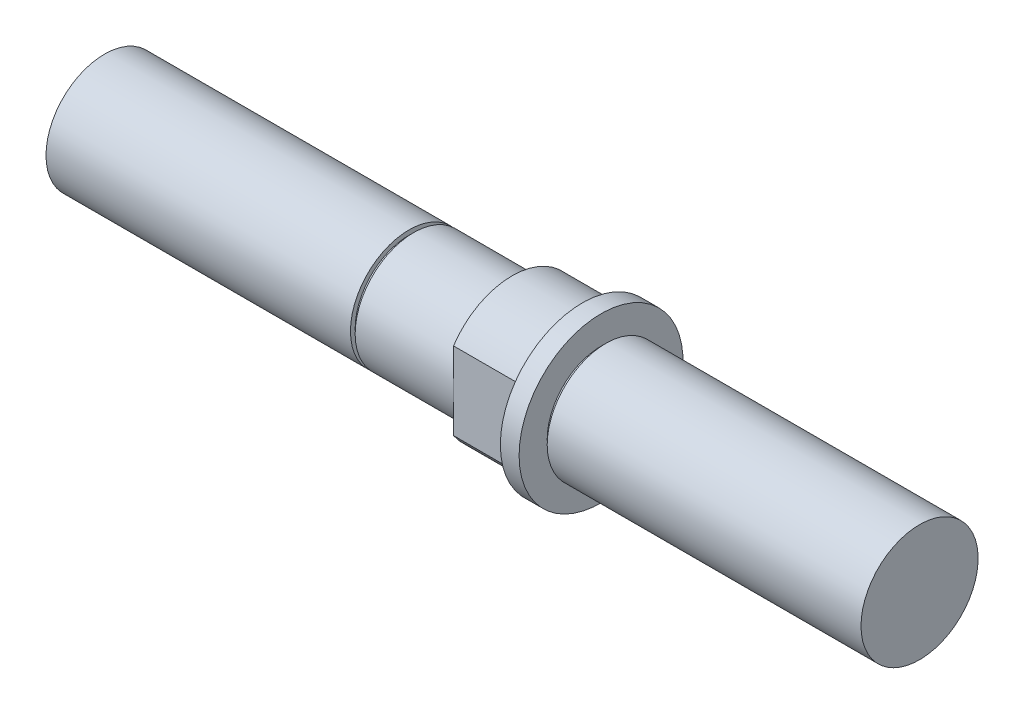
ISO-10303-21;
HEADER;
FILE_DESCRIPTION(('STEP AP214'),'2;1');
FILE_NAME('part.step','',(''),(''),'','','');
FILE_SCHEMA(('AUTOMOTIVE_DESIGN { 1 0 10303 214 1 1 1 1 }'));
ENDSEC;
DATA;
#1=APPLICATION_CONTEXT('core data for automotive mechanical design processes');
#2=APPLICATION_PROTOCOL_DEFINITION('international standard','automotive_design',2000,#1);
#3=PRODUCT_CONTEXT('',#1,'mechanical');
#4=PRODUCT('Part','Part','',(#3));
#5=PRODUCT_RELATED_PRODUCT_CATEGORY('part','',(#4));
#6=PRODUCT_DEFINITION_FORMATION('','',#4);
#7=PRODUCT_DEFINITION_CONTEXT('part definition',#1,'design');
#8=PRODUCT_DEFINITION('design','',#6,#7);
#9=PRODUCT_DEFINITION_SHAPE('','',#8);
#10=(LENGTH_UNIT() NAMED_UNIT(*) SI_UNIT(.MILLI.,.METRE.));
#11=(NAMED_UNIT(*) PLANE_ANGLE_UNIT() SI_UNIT($,.RADIAN.));
#12=(NAMED_UNIT(*) SI_UNIT($,.STERADIAN.) SOLID_ANGLE_UNIT());
#13=UNCERTAINTY_MEASURE_WITH_UNIT(LENGTH_MEASURE(1.E-05),#10,'distance_accuracy_value','');
#14=(GEOMETRIC_REPRESENTATION_CONTEXT(3) GLOBAL_UNCERTAINTY_ASSIGNED_CONTEXT((#13)) GLOBAL_UNIT_ASSIGNED_CONTEXT((#10,
#11,#12)) REPRESENTATION_CONTEXT('',''));
#15=CARTESIAN_POINT('',(0.,0.,0.));
#16=DIRECTION('',(0.,0.,1.));
#17=DIRECTION('',(1.,0.,0.));
#18=AXIS2_PLACEMENT_3D('',#15,#16,#17);
#19=CARTESIAN_POINT('',(-174.,0.,0.));
#20=DIRECTION('',(-1.,0.,0.));
#21=DIRECTION('',(0.,0.,1.));
#22=AXIS2_PLACEMENT_3D('',#19,#20,#21);
#23=CYLINDRICAL_SURFACE('',#22,15.);
#24=CARTESIAN_POINT('',(-72.,0.,0.));
#25=DIRECTION('',(-1.,0.,0.));
#26=DIRECTION('',(0.,0.,1.));
#27=AXIS2_PLACEMENT_3D('',#24,#25,#26);
#28=CIRCLE('',#27,15.);
#29=CARTESIAN_POINT('',(-72.,-8.29156197588849,-12.5));
#30=VERTEX_POINT('',#29);
#31=CARTESIAN_POINT('',(-72.,-8.29156197588848,12.5));
#32=VERTEX_POINT('',#31);
#33=EDGE_CURVE('E97',#30,#32,#28,.T.);
#34=ORIENTED_EDGE('',*,*,#33,.T.);
#35=DIRECTION('',(-1.,0.,0.));
#36=VECTOR('',#35,1.);
#37=CARTESIAN_POINT('',(-55.2294901687516,-8.29156197588848,12.5));
#38=LINE('',#37,#36);
#39=CARTESIAN_POINT('',(-87.,-8.29156197588848,12.5));
#40=VERTEX_POINT('',#39);
#41=EDGE_CURVE('E83',#32,#40,#38,.T.);
#42=ORIENTED_EDGE('',*,*,#41,.T.);
#43=CARTESIAN_POINT('',(-87.,0.,0.));
#44=DIRECTION('',(-1.,0.,0.));
#45=DIRECTION('',(0.,0.,1.));
#46=AXIS2_PLACEMENT_3D('',#43,#44,#45);
#47=CIRCLE('',#46,15.);
#48=CARTESIAN_POINT('',(-87.,-8.29156197588849,-12.5));
#49=VERTEX_POINT('',#48);
#50=EDGE_CURVE('E108',#49,#40,#47,.T.);
#51=ORIENTED_EDGE('',*,*,#50,.F.);
#52=DIRECTION('',(-1.,0.,0.));
#53=VECTOR('',#52,1.);
#54=CARTESIAN_POINT('',(-55.2294901687516,-8.29156197588849,-12.5));
#55=LINE('',#54,#53);
#56=EDGE_CURVE('E103',#30,#49,#55,.T.);
#57=ORIENTED_EDGE('',*,*,#56,.F.);
#58=EDGE_LOOP('',(#34,#42,#51,#57));
#59=FACE_BOUND('',#58,.T.);
#60=ADVANCED_FACE('F39',(#59),#23,.T.);
#61=CARTESIAN_POINT('',(-87.,8.2915619758885,12.5));
#62=VERTEX_POINT('',#61);
#63=CARTESIAN_POINT('',(-87.,8.29156197588849,-12.5));
#64=VERTEX_POINT('',#63);
#65=EDGE_CURVE('E104',#62,#64,#47,.T.);
#66=ORIENTED_EDGE('',*,*,#65,.F.);
#67=DIRECTION('',(-1.,0.,0.));
#68=VECTOR('',#67,1.);
#69=CARTESIAN_POINT('',(-55.2294901687516,8.2915619758885,12.5));
#70=LINE('',#69,#68);
#71=CARTESIAN_POINT('',(-72.,8.2915619758885,12.5));
#72=VERTEX_POINT('',#71);
#73=EDGE_CURVE('E54',#72,#62,#70,.T.);
#74=ORIENTED_EDGE('',*,*,#73,.F.);
#75=CARTESIAN_POINT('',(-72.,8.29156197588849,-12.5));
#76=VERTEX_POINT('',#75);
#77=EDGE_CURVE('E99',#72,#76,#28,.T.);
#78=ORIENTED_EDGE('',*,*,#77,.T.);
#79=DIRECTION('',(-1.,0.,0.));
#80=VECTOR('',#79,1.);
#81=CARTESIAN_POINT('',(-55.2294901687516,8.29156197588849,-12.5));
#82=LINE('',#81,#80);
#83=EDGE_CURVE('E180',#76,#64,#82,.T.);
#84=ORIENTED_EDGE('',*,*,#83,.T.);
#85=EDGE_LOOP('',(#66,#74,#78,#84));
#86=FACE_BOUND('',#85,.T.);
#87=ADVANCED_FACE('F136',(#86),#23,.T.);
#88=CARTESIAN_POINT('',(-87.,15.,0.));
#89=DIRECTION('',(1.,0.,0.));
#90=DIRECTION('',(0.,0.,-1.));
#91=AXIS2_PLACEMENT_3D('',#88,#89,#90);
#92=PLANE('',#91);
#93=ORIENTED_EDGE('',*,*,#50,.T.);
#94=DIRECTION('',(0.,1.,0.));
#95=VECTOR('',#94,1.);
#96=CARTESIAN_POINT('',(-87.,15.,12.5));
#97=LINE('',#96,#95);
#98=CARTESIAN_POINT('',(-87.,0.,12.5));
#99=VERTEX_POINT('',#98);
#100=EDGE_CURVE('E11',#40,#99,#97,.T.);
#101=ORIENTED_EDGE('',*,*,#100,.T.);
#102=CARTESIAN_POINT('',(-87.,0.,0.));
#103=DIRECTION('',(-1.,0.,0.));
#104=DIRECTION('',(0.,0.,1.));
#105=AXIS2_PLACEMENT_3D('',#102,#103,#104);
#106=CIRCLE('',#105,12.5);
#107=CARTESIAN_POINT('',(-87.,0.,-12.5));
#108=VERTEX_POINT('',#107);
#109=EDGE_CURVE('E195',#108,#99,#106,.T.);
#110=ORIENTED_EDGE('',*,*,#109,.F.);
#111=DIRECTION('',(0.,1.,0.));
#112=VECTOR('',#111,1.);
#113=CARTESIAN_POINT('',(-87.,15.,-12.5));
#114=LINE('',#113,#112);
#115=EDGE_CURVE('E47',#49,#108,#114,.T.);
#116=ORIENTED_EDGE('',*,*,#115,.F.);
#117=EDGE_LOOP('',(#93,#101,#110,#116));
#118=FACE_BOUND('',#117,.T.);
#119=ADVANCED_FACE('F141',(#118),#92,.F.);
#120=EDGE_CURVE('E196',#99,#108,#106,.T.);
#121=ORIENTED_EDGE('',*,*,#120,.F.);
#122=DIRECTION('',(0.,-1.,0.));
#123=VECTOR('',#122,1.);
#124=CARTESIAN_POINT('',(-87.,0.,12.5));
#125=LINE('',#124,#123);
#126=EDGE_CURVE('E100',#62,#99,#125,.T.);
#127=ORIENTED_EDGE('',*,*,#126,.F.);
#128=ORIENTED_EDGE('',*,*,#65,.T.);
#129=DIRECTION('',(0.,-1.,0.));
#130=VECTOR('',#129,1.);
#131=CARTESIAN_POINT('',(-87.,0.,-12.5));
#132=LINE('',#131,#130);
#133=EDGE_CURVE('E205',#64,#108,#132,.T.);
#134=ORIENTED_EDGE('',*,*,#133,.T.);
#135=EDGE_LOOP('',(#121,#127,#128,#134));
#136=FACE_BOUND('',#135,.T.);
#137=ADVANCED_FACE('F161',(#136),#92,.F.);
#138=CARTESIAN_POINT('',(-174.,0.,0.));
#139=DIRECTION('',(-1.,0.,0.));
#140=DIRECTION('',(0.,0.,1.));
#141=AXIS2_PLACEMENT_3D('',#138,#139,#140);
#142=CYLINDRICAL_SURFACE('',#141,12.5);
#143=ORIENTED_EDGE('',*,*,#120,.T.);
#144=ORIENTED_EDGE('',*,*,#109,.T.);
#145=EDGE_LOOP('',(#143,#144));
#146=FACE_BOUND('',#145,.T.);
#147=CARTESIAN_POINT('',(-108.,0.,0.));
#148=DIRECTION('',(-1.,0.,0.));
#149=DIRECTION('',(0.,0.,1.));
#150=AXIS2_PLACEMENT_3D('',#147,#148,#149);
#151=CIRCLE('',#150,12.5);
#152=CARTESIAN_POINT('',(-108.,0.,12.5));
#153=VERTEX_POINT('',#152);
#154=EDGE_CURVE('E189',#153,#153,#151,.T.);
#155=ORIENTED_EDGE('',*,*,#154,.F.);
#156=EDGE_LOOP('',(#155));
#157=FACE_BOUND('',#156,.T.);
#158=ADVANCED_FACE('F154',(#146,#157),#142,.T.);
#159=CARTESIAN_POINT('',(-68.,12.5,0.));
#160=DIRECTION('',(-1.,0.,0.));
#161=DIRECTION('',(0.,0.,1.));
#162=AXIS2_PLACEMENT_3D('',#159,#160,#161);
#163=PLANE('',#162);
#164=CARTESIAN_POINT('',(-68.,0.,0.));
#165=DIRECTION('',(-1.,0.,0.));
#166=DIRECTION('',(0.,0.,1.));
#167=AXIS2_PLACEMENT_3D('',#164,#165,#166);
#168=CIRCLE('',#167,17.5);
#169=CARTESIAN_POINT('',(-68.,0.,17.5));
#170=VERTEX_POINT('',#169);
#171=EDGE_CURVE('E114',#170,#170,#168,.T.);
#172=ORIENTED_EDGE('',*,*,#171,.F.);
#173=EDGE_LOOP('',(#172));
#174=FACE_BOUND('',#173,.T.);
#175=CARTESIAN_POINT('',(-68.,0.,0.));
#176=DIRECTION('',(-1.,0.,0.));
#177=DIRECTION('',(0.,0.,1.));
#178=AXIS2_PLACEMENT_3D('',#175,#176,#177);
#179=CIRCLE('',#178,11.5);
#180=CARTESIAN_POINT('',(-68.,0.,11.5));
#181=VERTEX_POINT('',#180);
#182=EDGE_CURVE('E168',#181,#181,#179,.T.);
#183=ORIENTED_EDGE('',*,*,#182,.T.);
#184=EDGE_LOOP('',(#183));
#185=FACE_BOUND('',#184,.T.);
#186=ADVANCED_FACE('F151',(#174,#185),#163,.F.);
#187=CARTESIAN_POINT('',(-174.,0.,0.));
#188=DIRECTION('',(-1.,0.,0.));
#189=DIRECTION('',(0.,0.,1.));
#190=AXIS2_PLACEMENT_3D('',#187,#188,#189);
#191=CYLINDRICAL_SURFACE('',#190,17.5);
#192=CARTESIAN_POINT('',(-72.,0.,0.));
#193=DIRECTION('',(-1.,0.,0.));
#194=DIRECTION('',(0.,0.,1.));
#195=AXIS2_PLACEMENT_3D('',#192,#193,#194);
#196=CIRCLE('',#195,17.5);
#197=CARTESIAN_POINT('',(-72.,0.,17.5));
#198=VERTEX_POINT('',#197);
#199=EDGE_CURVE('E106',#198,#198,#196,.T.);
#200=ORIENTED_EDGE('',*,*,#199,.F.);
#201=EDGE_LOOP('',(#200));
#202=FACE_BOUND('',#201,.T.);
#203=ORIENTED_EDGE('',*,*,#171,.T.);
#204=EDGE_LOOP('',(#203));
#205=FACE_BOUND('',#204,.T.);
#206=ADVANCED_FACE('F149',(#202,#205),#191,.T.);
#207=CARTESIAN_POINT('',(-72.,17.5,0.));
#208=DIRECTION('',(1.,0.,0.));
#209=DIRECTION('',(0.,0.,-1.));
#210=AXIS2_PLACEMENT_3D('',#207,#208,#209);
#211=PLANE('',#210);
#212=ORIENTED_EDGE('',*,*,#77,.F.);
#213=DIRECTION('',(0.,-1.,0.));
#214=VECTOR('',#213,1.);
#215=CARTESIAN_POINT('',(-72.,0.,12.5));
#216=LINE('',#215,#214);
#217=EDGE_CURVE('E86',#72,#32,#216,.T.);
#218=ORIENTED_EDGE('',*,*,#217,.T.);
#219=ORIENTED_EDGE('',*,*,#33,.F.);
#220=DIRECTION('',(0.,-1.,0.));
#221=VECTOR('',#220,1.);
#222=CARTESIAN_POINT('',(-72.,0.,-12.5));
#223=LINE('',#222,#221);
#224=EDGE_CURVE('E212',#76,#30,#223,.T.);
#225=ORIENTED_EDGE('',*,*,#224,.F.);
#226=EDGE_LOOP('',(#212,#218,#219,#225));
#227=FACE_BOUND('',#226,.T.);
#228=ORIENTED_EDGE('',*,*,#199,.T.);
#229=EDGE_LOOP('',(#228));
#230=FACE_BOUND('',#229,.T.);
#231=ADVANCED_FACE('F95',(#227,#230),#211,.F.);
#232=CARTESIAN_POINT('',(-109.,12.5,0.));
#233=DIRECTION('',(1.,0.,0.));
#234=DIRECTION('',(0.,0.,-1.));
#235=AXIS2_PLACEMENT_3D('',#232,#233,#234);
#236=PLANE('',#235);
#237=CARTESIAN_POINT('',(-109.,0.,0.));
#238=DIRECTION('',(-1.,0.,0.));
#239=DIRECTION('',(0.,0.,1.));
#240=AXIS2_PLACEMENT_3D('',#237,#238,#239);
#241=CIRCLE('',#240,11.5);
#242=CARTESIAN_POINT('',(-109.,0.,11.5));
#243=VERTEX_POINT('',#242);
#244=EDGE_CURVE('E171',#243,#243,#241,.T.);
#245=ORIENTED_EDGE('',*,*,#244,.T.);
#246=EDGE_LOOP('',(#245));
#247=FACE_BOUND('',#246,.T.);
#248=CARTESIAN_POINT('',(-109.,0.,0.));
#249=DIRECTION('',(-1.,0.,0.));
#250=DIRECTION('',(0.,0.,1.));
#251=AXIS2_PLACEMENT_3D('',#248,#249,#250);
#252=CIRCLE('',#251,12.5);
#253=CARTESIAN_POINT('',(-109.,0.,12.5));
#254=VERTEX_POINT('',#253);
#255=EDGE_CURVE('E186',#254,#254,#252,.T.);
#256=ORIENTED_EDGE('',*,*,#255,.F.);
#257=EDGE_LOOP('',(#256));
#258=FACE_BOUND('',#257,.T.);
#259=ADVANCED_FACE('F148',(#247,#258),#236,.T.);
#260=CARTESIAN_POINT('',(-174.,0.,0.));
#261=DIRECTION('',(-1.,0.,0.));
#262=DIRECTION('',(0.,0.,1.));
#263=AXIS2_PLACEMENT_3D('',#260,#261,#262);
#264=CYLINDRICAL_SURFACE('',#263,11.5);
#265=CARTESIAN_POINT('',(-108.,0.,0.));
#266=DIRECTION('',(-1.,0.,0.));
#267=DIRECTION('',(0.,0.,1.));
#268=AXIS2_PLACEMENT_3D('',#265,#266,#267);
#269=CIRCLE('',#268,11.5);
#270=CARTESIAN_POINT('',(-108.,0.,11.5));
#271=VERTEX_POINT('',#270);
#272=EDGE_CURVE('E177',#271,#271,#269,.T.);
#273=ORIENTED_EDGE('',*,*,#272,.T.);
#274=EDGE_LOOP('',(#273));
#275=FACE_BOUND('',#274,.T.);
#276=ORIENTED_EDGE('',*,*,#244,.F.);
#277=EDGE_LOOP('',(#276));
#278=FACE_BOUND('',#277,.T.);
#279=ADVANCED_FACE('F288',(#275,#278),#264,.T.);
#280=CARTESIAN_POINT('',(-108.,12.5,0.));
#281=DIRECTION('',(-1.,0.,0.));
#282=DIRECTION('',(0.,0.,1.));
#283=AXIS2_PLACEMENT_3D('',#280,#281,#282);
#284=PLANE('',#283);
#285=ORIENTED_EDGE('',*,*,#154,.T.);
#286=EDGE_LOOP('',(#285));
#287=FACE_BOUND('',#286,.T.);
#288=ORIENTED_EDGE('',*,*,#272,.F.);
#289=EDGE_LOOP('',(#288));
#290=FACE_BOUND('',#289,.T.);
#291=ADVANCED_FACE('F282',(#287,#290),#284,.T.);
#292=CARTESIAN_POINT('',(-174.,12.5,0.));
#293=DIRECTION('',(1.,0.,0.));
#294=DIRECTION('',(0.,0.,-1.));
#295=AXIS2_PLACEMENT_3D('',#292,#293,#294);
#296=PLANE('',#295);
#297=CARTESIAN_POINT('',(-174.,0.,0.));
#298=DIRECTION('',(-1.,0.,0.));
#299=DIRECTION('',(0.,0.,1.));
#300=AXIS2_PLACEMENT_3D('',#297,#298,#299);
#301=CIRCLE('',#300,12.5);
#302=CARTESIAN_POINT('',(-174.,0.,12.5));
#303=VERTEX_POINT('',#302);
#304=EDGE_CURVE('E185',#303,#303,#301,.T.);
#305=ORIENTED_EDGE('',*,*,#304,.T.);
#306=EDGE_LOOP('',(#305));
#307=FACE_BOUND('',#306,.T.);
#308=ADVANCED_FACE('F287',(#307),#296,.F.);
#309=ORIENTED_EDGE('',*,*,#304,.F.);
#310=EDGE_LOOP('',(#309));
#311=FACE_BOUND('',#310,.T.);
#312=ORIENTED_EDGE('',*,*,#255,.T.);
#313=EDGE_LOOP('',(#312));
#314=FACE_BOUND('',#313,.T.);
#315=ADVANCED_FACE('F163',(#311,#314),#142,.T.);
#316=CARTESIAN_POINT('',(-67.,12.5,0.));
#317=DIRECTION('',(-1.,0.,0.));
#318=DIRECTION('',(0.,0.,1.));
#319=AXIS2_PLACEMENT_3D('',#316,#317,#318);
#320=PLANE('',#319);
#321=CARTESIAN_POINT('',(-67.,0.,0.));
#322=DIRECTION('',(-1.,0.,0.));
#323=DIRECTION('',(0.,0.,1.));
#324=AXIS2_PLACEMENT_3D('',#321,#322,#323);
#325=CIRCLE('',#324,12.5);
#326=CARTESIAN_POINT('',(-67.,0.,12.5));
#327=VERTEX_POINT('',#326);
#328=EDGE_CURVE('E174',#327,#327,#325,.T.);
#329=ORIENTED_EDGE('',*,*,#328,.T.);
#330=EDGE_LOOP('',(#329));
#331=FACE_BOUND('',#330,.T.);
#332=CARTESIAN_POINT('',(-67.,0.,0.));
#333=DIRECTION('',(-1.,0.,0.));
#334=DIRECTION('',(0.,0.,1.));
#335=AXIS2_PLACEMENT_3D('',#332,#333,#334);
#336=CIRCLE('',#335,11.5);
#337=CARTESIAN_POINT('',(-67.,0.,11.5));
#338=VERTEX_POINT('',#337);
#339=EDGE_CURVE('E170',#338,#338,#336,.T.);
#340=ORIENTED_EDGE('',*,*,#339,.F.);
#341=EDGE_LOOP('',(#340));
#342=FACE_BOUND('',#341,.T.);
#343=ADVANCED_FACE('F132',(#331,#342),#320,.T.);
#344=CARTESIAN_POINT('',(-174.,0.,0.));
#345=DIRECTION('',(-1.,0.,0.));
#346=DIRECTION('',(0.,0.,1.));
#347=AXIS2_PLACEMENT_3D('',#344,#345,#346);
#348=CYLINDRICAL_SURFACE('',#347,11.5);
#349=ORIENTED_EDGE('',*,*,#339,.T.);
#350=EDGE_LOOP('',(#349));
#351=FACE_BOUND('',#350,.T.);
#352=ORIENTED_EDGE('',*,*,#182,.F.);
#353=EDGE_LOOP('',(#352));
#354=FACE_BOUND('',#353,.T.);
#355=ADVANCED_FACE('F125',(#351,#354),#348,.T.);
#356=CARTESIAN_POINT('',(0.,0.,0.));
#357=DIRECTION('',(-1.,0.,0.));
#358=DIRECTION('',(0.,0.,1.));
#359=AXIS2_PLACEMENT_3D('',#356,#357,#358);
#360=PLANE('',#359);
#361=CARTESIAN_POINT('',(0.,0.,0.));
#362=DIRECTION('',(-1.,0.,0.));
#363=DIRECTION('',(0.,0.,1.));
#364=AXIS2_PLACEMENT_3D('',#361,#362,#363);
#365=CIRCLE('',#364,12.5);
#366=CARTESIAN_POINT('',(0.,0.,12.5));
#367=VERTEX_POINT('',#366);
#368=EDGE_CURVE('E117',#367,#367,#365,.T.);
#369=ORIENTED_EDGE('',*,*,#368,.F.);
#370=EDGE_LOOP('',(#369));
#371=FACE_BOUND('',#370,.T.);
#372=ADVANCED_FACE('F41',(#371),#360,.F.);
#373=CARTESIAN_POINT('',(-174.,0.,0.));
#374=DIRECTION('',(-1.,0.,0.));
#375=DIRECTION('',(0.,0.,1.));
#376=AXIS2_PLACEMENT_3D('',#373,#374,#375);
#377=CYLINDRICAL_SURFACE('',#376,12.5);
#378=ORIENTED_EDGE('',*,*,#368,.T.);
#379=EDGE_LOOP('',(#378));
#380=FACE_BOUND('',#379,.T.);
#381=ORIENTED_EDGE('',*,*,#328,.F.);
#382=EDGE_LOOP('',(#381));
#383=FACE_BOUND('',#382,.T.);
#384=ADVANCED_FACE('F121',(#380,#383),#377,.T.);
#385=CARTESIAN_POINT('',(-55.2294901687516,0.,-12.5));
#386=DIRECTION('',(0.,0.,-1.));
#387=DIRECTION('',(-1.,0.,0.));
#388=AXIS2_PLACEMENT_3D('',#385,#386,#387);
#389=PLANE('',#388);
#390=ORIENTED_EDGE('',*,*,#224,.T.);
#391=ORIENTED_EDGE('',*,*,#56,.T.);
#392=ORIENTED_EDGE('',*,*,#115,.T.);
#393=ORIENTED_EDGE('',*,*,#133,.F.);
#394=ORIENTED_EDGE('',*,*,#83,.F.);
#395=EDGE_LOOP('',(#390,#391,#392,#393,#394));
#396=FACE_BOUND('',#395,.T.);
#397=ADVANCED_FACE('F130',(#396),#389,.T.);
#398=CARTESIAN_POINT('',(-55.2294901687516,0.,12.5));
#399=DIRECTION('',(0.,0.,-1.));
#400=DIRECTION('',(0.,1.,0.));
#401=AXIS2_PLACEMENT_3D('',#398,#399,#400);
#402=PLANE('',#401);
#403=ORIENTED_EDGE('',*,*,#73,.T.);
#404=ORIENTED_EDGE('',*,*,#126,.T.);
#405=ORIENTED_EDGE('',*,*,#100,.F.);
#406=ORIENTED_EDGE('',*,*,#41,.F.);
#407=ORIENTED_EDGE('',*,*,#217,.F.);
#408=EDGE_LOOP('',(#403,#404,#405,#406,#407));
#409=FACE_BOUND('',#408,.T.);
#410=ADVANCED_FACE('F85',(#409),#402,.F.);
#411=CLOSED_SHELL('',(#60,#87,#119,#137,#158,#186,#206,#231,#259,#279,#291,#308,#315,#343,#355,
#372,#384,#397,#410));
#412=MANIFOLD_SOLID_BREP('B2',#411);
#413=ADVANCED_BREP_SHAPE_REPRESENTATION('',(#18,#412),#14);
#414=SHAPE_DEFINITION_REPRESENTATION(#9,#413);
ENDSEC;
END-ISO-10303-21;
